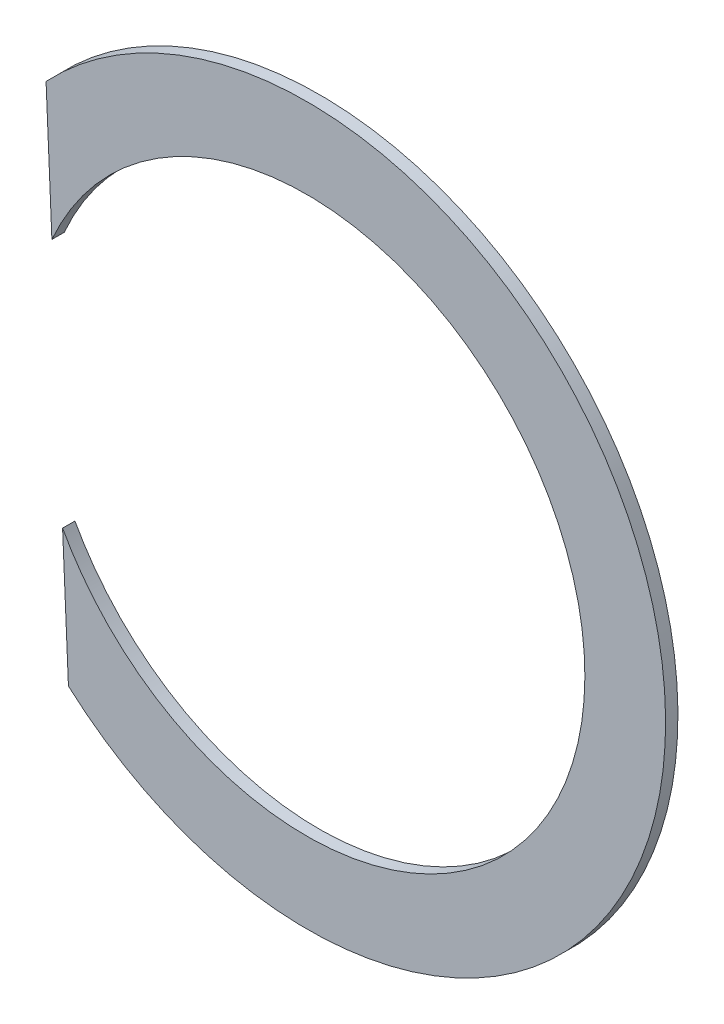
ISO-10303-21;
HEADER;
FILE_DESCRIPTION(('STEP AP214'),'2;1');
FILE_NAME('part.step','',(''),(''),'','','');
FILE_SCHEMA(('AUTOMOTIVE_DESIGN { 1 0 10303 214 1 1 1 1 }'));
ENDSEC;
DATA;
#1=APPLICATION_CONTEXT('core data for automotive mechanical design processes');
#2=APPLICATION_PROTOCOL_DEFINITION('international standard','automotive_design',2000,#1);
#3=PRODUCT_CONTEXT('',#1,'mechanical');
#4=PRODUCT('Part','Part','',(#3));
#5=PRODUCT_RELATED_PRODUCT_CATEGORY('part','',(#4));
#6=PRODUCT_DEFINITION_FORMATION('','',#4);
#7=PRODUCT_DEFINITION_CONTEXT('part definition',#1,'design');
#8=PRODUCT_DEFINITION('design','',#6,#7);
#9=PRODUCT_DEFINITION_SHAPE('','',#8);
#10=(LENGTH_UNIT() NAMED_UNIT(*) SI_UNIT(.MILLI.,.METRE.));
#11=(NAMED_UNIT(*) PLANE_ANGLE_UNIT() SI_UNIT($,.RADIAN.));
#12=(NAMED_UNIT(*) SI_UNIT($,.STERADIAN.) SOLID_ANGLE_UNIT());
#13=UNCERTAINTY_MEASURE_WITH_UNIT(LENGTH_MEASURE(1.E-05),#10,'distance_accuracy_value','');
#14=(GEOMETRIC_REPRESENTATION_CONTEXT(3) GLOBAL_UNCERTAINTY_ASSIGNED_CONTEXT((#13)) GLOBAL_UNIT_ASSIGNED_CONTEXT((#10,
#11,#12)) REPRESENTATION_CONTEXT('',''));
#15=CARTESIAN_POINT('',(0.,0.,0.));
#16=DIRECTION('',(0.,0.,1.));
#17=DIRECTION('',(1.,0.,0.));
#18=AXIS2_PLACEMENT_3D('',#15,#16,#17);
#19=CARTESIAN_POINT('',(0.0424019293,0.0018513082,1.));
#20=DIRECTION('',(0.,0.,-1.));
#21=DIRECTION('',(0.999048221581858,0.0436193873653291,0.));
#22=AXIS2_PLACEMENT_3D('',#19,#20,#21);
#23=ELLIPSE('',#22,22.5214354161747,22.5000000004086);
#24=DIRECTION('',(0.,0.,-1.));
#25=VECTOR('',#24,1.);
#26=SURFACE_OF_LINEAR_EXTRUSION('',#23,#25);
#27=CARTESIAN_POINT('',(0.0424019293,0.0018513082,0.));
#28=DIRECTION('',(0.,0.,-1.));
#29=DIRECTION('',(0.999048221581858,0.0436193873653291,0.));
#30=AXIS2_PLACEMENT_3D('',#27,#28,#29);
#31=ELLIPSE('',#30,22.5214354161747,22.5000000004086);
#32=CARTESIAN_POINT('',(-20.5883842035806,9.02395613878572,0.));
#33=VERTEX_POINT('',#32);
#34=CARTESIAN_POINT('',(-19.7235495861049,-10.7840131784974,0.));
#35=VERTEX_POINT('',#34);
#36=EDGE_CURVE('E102',#33,#35,#31,.T.);
#37=ORIENTED_EDGE('',*,*,#36,.T.);
#38=DIRECTION('',(0.,0.,-1.));
#39=VECTOR('',#38,1.);
#40=CARTESIAN_POINT('',(-19.7235495861049,-10.7840131784974,1.));
#41=LINE('',#40,#39);
#42=CARTESIAN_POINT('',(-19.7235495861049,-10.7840131784974,1.));
#43=VERTEX_POINT('',#42);
#44=EDGE_CURVE('E11',#43,#35,#41,.T.);
#45=ORIENTED_EDGE('',*,*,#44,.F.);
#46=CARTESIAN_POINT('',(-20.5883842035806,9.02395613878572,1.));
#47=VERTEX_POINT('',#46);
#48=EDGE_CURVE('E91',#47,#43,#23,.T.);
#49=ORIENTED_EDGE('',*,*,#48,.F.);
#50=DIRECTION('',(0.,0.,-1.));
#51=VECTOR('',#50,1.);
#52=CARTESIAN_POINT('',(-20.5883842035806,9.02395613878572,1.));
#53=LINE('',#52,#51);
#54=EDGE_CURVE('E99',#47,#33,#53,.T.);
#55=ORIENTED_EDGE('',*,*,#54,.T.);
#56=EDGE_LOOP('',(#37,#45,#49,#55));
#57=FACE_BOUND('',#56,.T.);
#58=ADVANCED_FACE('F39',(#57),#26,.F.);
#59=CARTESIAN_POINT('',(-19.7235495861049,-10.7840131784974,1.));
#60=DIRECTION('',(0.999048221581753,0.0436193873677411,0.));
#61=DIRECTION('',(-0.0436193873677411,0.999048221581753,0.));
#62=AXIS2_PLACEMENT_3D('',#59,#60,#61);
#63=PLANE('',#62);
#64=DIRECTION('',(0.0436193873677411,-0.999048221581753,0.));
#65=VECTOR('',#64,1.);
#66=CARTESIAN_POINT('',(-19.7235495861049,-10.7840131784974,0.));
#67=LINE('',#66,#65);
#68=CARTESIAN_POINT('',(-19.2501033828952,-21.6277140160075,0.));
#69=VERTEX_POINT('',#68);
#70=EDGE_CURVE('E95',#35,#69,#67,.T.);
#71=ORIENTED_EDGE('',*,*,#70,.T.);
#72=DIRECTION('',(0.,0.,-1.));
#73=VECTOR('',#72,1.);
#74=CARTESIAN_POINT('',(-19.2501033828952,-21.6277140160075,1.));
#75=LINE('',#74,#73);
#76=CARTESIAN_POINT('',(-19.2501033828952,-21.6277140160075,1.));
#77=VERTEX_POINT('',#76);
#78=EDGE_CURVE('E48',#77,#69,#75,.T.);
#79=ORIENTED_EDGE('',*,*,#78,.F.);
#80=DIRECTION('',(0.0436193873677411,-0.999048221581753,0.));
#81=VECTOR('',#80,1.);
#82=CARTESIAN_POINT('',(-19.7235495861049,-10.7840131784974,1.));
#83=LINE('',#82,#81);
#84=EDGE_CURVE('E86',#43,#77,#83,.T.);
#85=ORIENTED_EDGE('',*,*,#84,.F.);
#86=ORIENTED_EDGE('',*,*,#44,.T.);
#87=EDGE_LOOP('',(#71,#79,#85,#86));
#88=FACE_BOUND('',#87,.T.);
#89=ADVANCED_FACE('F94',(#88),#63,.F.);
#90=CARTESIAN_POINT('',(0.0860213167,0.0037557718,1.));
#91=DIRECTION('',(0.,0.,-1.));
#92=DIRECTION('',(-1.,0.,0.));
#93=AXIS2_PLACEMENT_3D('',#90,#91,#92);
#94=CYLINDRICAL_SURFACE('',#93,29.0138967320684);
#95=CARTESIAN_POINT('',(0.0860213167,0.0037557718,0.));
#96=DIRECTION('',(0.,0.,1.));
#97=DIRECTION('',(1.,0.,0.));
#98=AXIS2_PLACEMENT_3D('',#95,#96,#97);
#99=CIRCLE('',#98,29.0138967320684);
#100=CARTESIAN_POINT('',(-21.0618304067568,19.8676569762918,0.));
#101=VERTEX_POINT('',#100);
#102=EDGE_CURVE('E73',#69,#101,#99,.T.);
#103=ORIENTED_EDGE('',*,*,#102,.T.);
#104=DIRECTION('',(0.,0.,-1.));
#105=VECTOR('',#104,1.);
#106=CARTESIAN_POINT('',(-21.0618304067568,19.8676569762918,1.));
#107=LINE('',#106,#105);
#108=CARTESIAN_POINT('',(-21.0618304067568,19.8676569762918,1.));
#109=VERTEX_POINT('',#108);
#110=EDGE_CURVE('E96',#109,#101,#107,.T.);
#111=ORIENTED_EDGE('',*,*,#110,.F.);
#112=CARTESIAN_POINT('',(0.0860213167,0.0037557718,1.));
#113=DIRECTION('',(0.,0.,1.));
#114=DIRECTION('',(1.,0.,0.));
#115=AXIS2_PLACEMENT_3D('',#112,#113,#114);
#116=CIRCLE('',#115,29.0138967320684);
#117=EDGE_CURVE('E89',#77,#109,#116,.T.);
#118=ORIENTED_EDGE('',*,*,#117,.F.);
#119=ORIENTED_EDGE('',*,*,#78,.T.);
#120=EDGE_LOOP('',(#103,#111,#118,#119));
#121=FACE_BOUND('',#120,.T.);
#122=ADVANCED_FACE('F97',(#121),#94,.T.);
#123=CARTESIAN_POINT('',(-21.0618304067568,19.8676569762918,1.));
#124=DIRECTION('',(0.999048221581886,0.0436193873646824,0.));
#125=DIRECTION('',(-0.0436193873646824,0.999048221581886,0.));
#126=AXIS2_PLACEMENT_3D('',#123,#124,#125);
#127=PLANE('',#126);
#128=DIRECTION('',(0.0436193873646824,-0.999048221581886,0.));
#129=VECTOR('',#128,1.);
#130=CARTESIAN_POINT('',(-21.0618304067568,19.8676569762918,0.));
#131=LINE('',#130,#129);
#132=EDGE_CURVE('E79',#101,#33,#131,.T.);
#133=ORIENTED_EDGE('',*,*,#132,.T.);
#134=ORIENTED_EDGE('',*,*,#54,.F.);
#135=DIRECTION('',(0.0436193873646824,-0.999048221581886,0.));
#136=VECTOR('',#135,1.);
#137=CARTESIAN_POINT('',(-21.0618304067568,19.8676569762918,1.));
#138=LINE('',#137,#136);
#139=EDGE_CURVE('E56',#109,#47,#138,.T.);
#140=ORIENTED_EDGE('',*,*,#139,.F.);
#141=ORIENTED_EDGE('',*,*,#110,.T.);
#142=EDGE_LOOP('',(#133,#134,#140,#141));
#143=FACE_BOUND('',#142,.T.);
#144=ADVANCED_FACE('F109',(#143),#127,.F.);
#145=CARTESIAN_POINT('',(0.0424019293,0.0018513082,1.));
#146=DIRECTION('',(0.,0.,1.));
#147=DIRECTION('',(1.,0.,0.));
#148=AXIS2_PLACEMENT_3D('',#145,#146,#147);
#149=PLANE('',#148);
#150=ORIENTED_EDGE('',*,*,#48,.T.);
#151=ORIENTED_EDGE('',*,*,#84,.T.);
#152=ORIENTED_EDGE('',*,*,#117,.T.);
#153=ORIENTED_EDGE('',*,*,#139,.T.);
#154=EDGE_LOOP('',(#150,#151,#152,#153));
#155=FACE_BOUND('',#154,.T.);
#156=ADVANCED_FACE('F87',(#155),#149,.T.);
#157=CARTESIAN_POINT('',(0.0424019293,0.0018513082,0.));
#158=DIRECTION('',(0.,0.,1.));
#159=DIRECTION('',(1.,0.,0.));
#160=AXIS2_PLACEMENT_3D('',#157,#158,#159);
#161=PLANE('',#160);
#162=ORIENTED_EDGE('',*,*,#36,.F.);
#163=ORIENTED_EDGE('',*,*,#132,.F.);
#164=ORIENTED_EDGE('',*,*,#102,.F.);
#165=ORIENTED_EDGE('',*,*,#70,.F.);
#166=EDGE_LOOP('',(#162,#163,#164,#165));
#167=FACE_BOUND('',#166,.T.);
#168=ADVANCED_FACE('F112',(#167),#161,.F.);
#169=CLOSED_SHELL('',(#58,#89,#122,#144,#156,#168));
#170=MANIFOLD_SOLID_BREP('B2',#169);
#171=ADVANCED_BREP_SHAPE_REPRESENTATION('',(#18,#170),#14);
#172=SHAPE_DEFINITION_REPRESENTATION(#9,#171);
ENDSEC;
END-ISO-10303-21;
